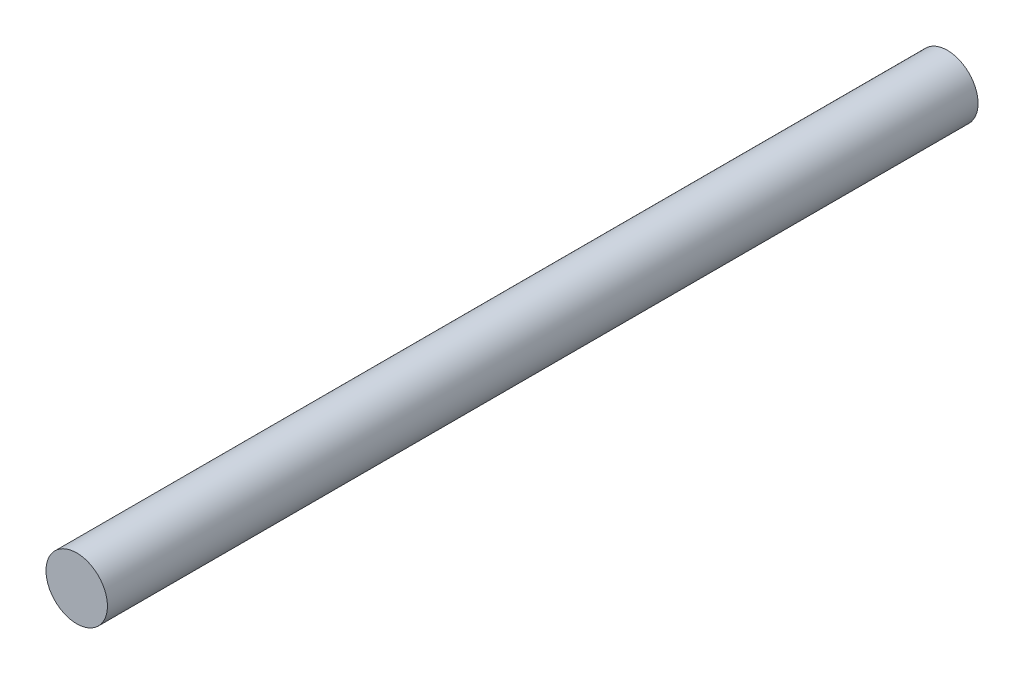
ISO-10303-21;
HEADER;
FILE_DESCRIPTION(('STEP AP214'),'2;1');
FILE_NAME('part.step','',(''),(''),'','','');
FILE_SCHEMA(('AUTOMOTIVE_DESIGN { 1 0 10303 214 1 1 1 1 }'));
ENDSEC;
DATA;
#1=APPLICATION_CONTEXT('core data for automotive mechanical design processes');
#2=APPLICATION_PROTOCOL_DEFINITION('international standard','automotive_design',2000,#1);
#3=PRODUCT_CONTEXT('',#1,'mechanical');
#4=PRODUCT('Part','Part','',(#3));
#5=PRODUCT_RELATED_PRODUCT_CATEGORY('part','',(#4));
#6=PRODUCT_DEFINITION_FORMATION('','',#4);
#7=PRODUCT_DEFINITION_CONTEXT('part definition',#1,'design');
#8=PRODUCT_DEFINITION('design','',#6,#7);
#9=PRODUCT_DEFINITION_SHAPE('','',#8);
#10=(LENGTH_UNIT() NAMED_UNIT(*) SI_UNIT(.MILLI.,.METRE.));
#11=(NAMED_UNIT(*) PLANE_ANGLE_UNIT() SI_UNIT($,.RADIAN.));
#12=(NAMED_UNIT(*) SI_UNIT($,.STERADIAN.) SOLID_ANGLE_UNIT());
#13=UNCERTAINTY_MEASURE_WITH_UNIT(LENGTH_MEASURE(1.E-05),#10,'distance_accuracy_value','');
#14=(GEOMETRIC_REPRESENTATION_CONTEXT(3) GLOBAL_UNCERTAINTY_ASSIGNED_CONTEXT((#13)) GLOBAL_UNIT_ASSIGNED_CONTEXT((#10,
#11,#12)) REPRESENTATION_CONTEXT('',''));
#15=CARTESIAN_POINT('',(0.,0.,0.));
#16=DIRECTION('',(0.,0.,1.));
#17=DIRECTION('',(1.,0.,0.));
#18=AXIS2_PLACEMENT_3D('',#15,#16,#17);
#19=CARTESIAN_POINT('',(0.,0.,22.5));
#20=DIRECTION('',(0.,0.,-1.));
#21=DIRECTION('',(-1.,0.,0.));
#22=AXIS2_PLACEMENT_3D('',#19,#20,#21);
#23=CYLINDRICAL_SURFACE('',#22,1.5875);
#24=CARTESIAN_POINT('',(0.,0.,22.5));
#25=DIRECTION('',(0.,0.,1.));
#26=DIRECTION('',(1.,0.,0.));
#27=AXIS2_PLACEMENT_3D('',#24,#25,#26);
#28=CIRCLE('',#27,1.5875);
#29=CARTESIAN_POINT('',(-1.5875,0.,22.5));
#30=VERTEX_POINT('',#29);
#31=EDGE_CURVE('E10',#30,#30,#28,.T.);
#32=CARTESIAN_POINT('',(0.,0.,-22.5));
#33=DIRECTION('',(0.,0.,1.));
#34=DIRECTION('',(1.,0.,0.));
#35=AXIS2_PLACEMENT_3D('',#32,#33,#34);
#36=CIRCLE('',#35,1.5875);
#37=CARTESIAN_POINT('',(-1.5875,0.,-22.5));
#38=VERTEX_POINT('',#37);
#39=EDGE_CURVE('E33',#38,#38,#36,.T.);
#40=CARTESIAN_POINT('',(-1.5875,0.,22.5));
#41=CARTESIAN_POINT('',(-1.5875,0.,22.03125));
#42=CARTESIAN_POINT('',(-1.5875,0.,21.5625));
#43=CARTESIAN_POINT('',(-1.5875,0.,20.625));
#44=CARTESIAN_POINT('',(-1.5875,0.,20.15625));
#45=CARTESIAN_POINT('',(-1.5875,0.,19.21875));
#46=CARTESIAN_POINT('',(-1.5875,0.,18.75));
#47=CARTESIAN_POINT('',(-1.5875,0.,17.8125));
#48=CARTESIAN_POINT('',(-1.5875,0.,17.34375));
#49=CARTESIAN_POINT('',(-1.5875,0.,16.40625));
#50=CARTESIAN_POINT('',(-1.5875,0.,15.9375));
#51=CARTESIAN_POINT('',(-1.5875,0.,15.));
#52=CARTESIAN_POINT('',(-1.5875,0.,14.53125));
#53=CARTESIAN_POINT('',(-1.5875,0.,13.59375));
#54=CARTESIAN_POINT('',(-1.5875,0.,13.125));
#55=CARTESIAN_POINT('',(-1.5875,0.,12.1875));
#56=CARTESIAN_POINT('',(-1.5875,0.,11.71875));
#57=CARTESIAN_POINT('',(-1.5875,0.,10.78125));
#58=CARTESIAN_POINT('',(-1.5875,0.,10.3125));
#59=CARTESIAN_POINT('',(-1.5875,0.,9.37499999999999));
#60=CARTESIAN_POINT('',(-1.5875,0.,8.90625));
#61=CARTESIAN_POINT('',(-1.5875,0.,7.96874999999999));
#62=CARTESIAN_POINT('',(-1.5875,0.,7.5));
#63=CARTESIAN_POINT('',(-1.5875,0.,6.5625));
#64=CARTESIAN_POINT('',(-1.5875,0.,6.09375));
#65=CARTESIAN_POINT('',(-1.5875,0.,5.15625));
#66=CARTESIAN_POINT('',(-1.5875,0.,4.6875));
#67=CARTESIAN_POINT('',(-1.5875,0.,3.75));
#68=CARTESIAN_POINT('',(-1.5875,0.,3.28125));
#69=CARTESIAN_POINT('',(-1.5875,0.,2.34375));
#70=CARTESIAN_POINT('',(-1.5875,0.,1.875));
#71=CARTESIAN_POINT('',(-1.5875,0.,0.937499999999997));
#72=CARTESIAN_POINT('',(-1.5875,0.,0.468749999999997));
#73=CARTESIAN_POINT('',(-1.5875,0.,-0.468750000000004));
#74=CARTESIAN_POINT('',(-1.5875,0.,-0.937500000000004));
#75=CARTESIAN_POINT('',(-1.5875,0.,-1.87500000000001));
#76=CARTESIAN_POINT('',(-1.5875,0.,-2.34375000000001));
#77=CARTESIAN_POINT('',(-1.5875,0.,-3.28125));
#78=CARTESIAN_POINT('',(-1.5875,0.,-3.75));
#79=CARTESIAN_POINT('',(-1.5875,0.,-4.6875));
#80=CARTESIAN_POINT('',(-1.5875,0.,-5.15625));
#81=CARTESIAN_POINT('',(-1.5875,0.,-6.09375000000001));
#82=CARTESIAN_POINT('',(-1.5875,0.,-6.56250000000001));
#83=CARTESIAN_POINT('',(-1.5875,0.,-7.50000000000001));
#84=CARTESIAN_POINT('',(-1.5875,0.,-7.96875000000001));
#85=CARTESIAN_POINT('',(-1.5875,0.,-8.90625));
#86=CARTESIAN_POINT('',(-1.5875,0.,-9.37500000000001));
#87=CARTESIAN_POINT('',(-1.5875,0.,-10.3125));
#88=CARTESIAN_POINT('',(-1.5875,0.,-10.78125));
#89=CARTESIAN_POINT('',(-1.5875,0.,-11.71875));
#90=CARTESIAN_POINT('',(-1.5875,0.,-12.1875));
#91=CARTESIAN_POINT('',(-1.5875,0.,-13.125));
#92=CARTESIAN_POINT('',(-1.5875,0.,-13.59375));
#93=CARTESIAN_POINT('',(-1.5875,0.,-14.53125));
#94=CARTESIAN_POINT('',(-1.5875,0.,-15.));
#95=CARTESIAN_POINT('',(-1.5875,0.,-15.9375));
#96=CARTESIAN_POINT('',(-1.5875,0.,-16.40625));
#97=CARTESIAN_POINT('',(-1.5875,0.,-17.34375));
#98=CARTESIAN_POINT('',(-1.5875,0.,-17.8125));
#99=CARTESIAN_POINT('',(-1.5875,0.,-18.75));
#100=CARTESIAN_POINT('',(-1.5875,0.,-19.21875));
#101=CARTESIAN_POINT('',(-1.5875,0.,-20.15625));
#102=CARTESIAN_POINT('',(-1.5875,0.,-20.625));
#103=CARTESIAN_POINT('',(-1.5875,0.,-21.5625));
#104=CARTESIAN_POINT('',(-1.5875,0.,-22.03125));
#105=CARTESIAN_POINT('',(-1.5875,0.,-22.5));
#106=B_SPLINE_CURVE_WITH_KNOTS('',3,(#40,#41,#42,#43,#44,#45,#46,#47,#48,#49,#50,#51,#52,#53,
#54,#55,#56,#57,#58,#59,#60,#61,#62,#63,#64,#65,#66,#67,#68,#69,#70,#71,#72,#73,#74,#75,#76,#77,
#78,#79,#80,#81,#82,#83,#84,#85,#86,#87,#88,#89,#90,#91,#92,#93,#94,#95,#96,#97,#98,#99,#100,
#101,#102,#103,#104,#105),.UNSPECIFIED.,.F.,.F.,(4,2,2,2,2,2,2,2,2,2,2,2,2,2,2,2,2,2,2,2,2,2,2,
2,2,2,2,2,2,2,2,2,4),(0.,1.40625,2.8125,4.21875,5.625,7.03125,8.4375,9.84375,11.25,12.65625,
14.0625,15.46875,16.875,18.28125,19.6875,21.09375,22.5,23.90625,25.3125,26.71875,28.125,
29.53125,30.9375,32.34375,33.75,35.15625,36.5625,37.96875,39.375,40.78125,42.1875,43.59375,45.),.UNSPECIFIED.);
#107=EDGE_CURVE('BSEAM30',#30,#38,#106,.T.);
#108=ORIENTED_EDGE('',*,*,#31,.F.);
#109=ORIENTED_EDGE('',*,*,#39,.T.);
#110=ORIENTED_EDGE('',*,*,#107,.T.);
#111=ORIENTED_EDGE('',*,*,#107,.F.);
#112=EDGE_LOOP('',(#108,#110,#109,#111));
#113=FACE_BOUND('',#112,.T.);
#114=ADVANCED_FACE('F30',(#113),#23,.T.);
#115=CARTESIAN_POINT('',(0.,0.,22.5));
#116=DIRECTION('',(0.,0.,1.));
#117=DIRECTION('',(1.,0.,0.));
#118=AXIS2_PLACEMENT_3D('',#115,#116,#117);
#119=PLANE('',#118);
#120=ORIENTED_EDGE('',*,*,#31,.T.);
#121=EDGE_LOOP('',(#120));
#122=FACE_BOUND('',#121,.T.);
#123=ADVANCED_FACE('F45',(#122),#119,.T.);
#124=CARTESIAN_POINT('',(0.,0.,-22.5));
#125=DIRECTION('',(0.,0.,1.));
#126=DIRECTION('',(1.,0.,0.));
#127=AXIS2_PLACEMENT_3D('',#124,#125,#126);
#128=PLANE('',#127);
#129=ORIENTED_EDGE('',*,*,#39,.F.);
#130=EDGE_LOOP('',(#129));
#131=FACE_BOUND('',#130,.T.);
#132=ADVANCED_FACE('F43',(#131),#128,.F.);
#133=CLOSED_SHELL('',(#114,#123,#132));
#134=MANIFOLD_SOLID_BREP('B2',#133);
#135=ADVANCED_BREP_SHAPE_REPRESENTATION('',(#18,#134),#14);
#136=SHAPE_DEFINITION_REPRESENTATION(#9,#135);
ENDSEC;
END-ISO-10303-21;
